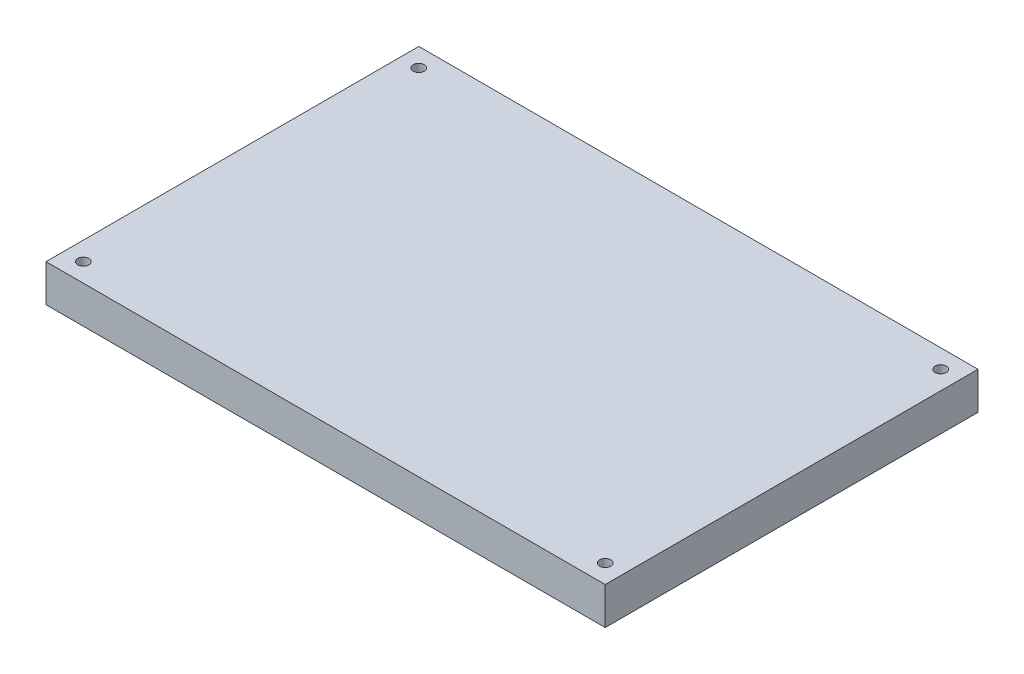
ISO-10303-21;
HEADER;
FILE_DESCRIPTION(('STEP AP214'),'2;1');
FILE_NAME('part.step','',(''),(''),'','','');
FILE_SCHEMA(('AUTOMOTIVE_DESIGN { 1 0 10303 214 1 1 1 1 }'));
ENDSEC;
DATA;
#1=APPLICATION_CONTEXT('core data for automotive mechanical design processes');
#2=APPLICATION_PROTOCOL_DEFINITION('international standard','automotive_design',2000,#1);
#3=PRODUCT_CONTEXT('',#1,'mechanical');
#4=PRODUCT('Part','Part','',(#3));
#5=PRODUCT_RELATED_PRODUCT_CATEGORY('part','',(#4));
#6=PRODUCT_DEFINITION_FORMATION('','',#4);
#7=PRODUCT_DEFINITION_CONTEXT('part definition',#1,'design');
#8=PRODUCT_DEFINITION('design','',#6,#7);
#9=PRODUCT_DEFINITION_SHAPE('','',#8);
#10=(LENGTH_UNIT() NAMED_UNIT(*) SI_UNIT(.MILLI.,.METRE.));
#11=(NAMED_UNIT(*) PLANE_ANGLE_UNIT() SI_UNIT($,.RADIAN.));
#12=(NAMED_UNIT(*) SI_UNIT($,.STERADIAN.) SOLID_ANGLE_UNIT());
#13=UNCERTAINTY_MEASURE_WITH_UNIT(LENGTH_MEASURE(1.E-05),#10,'distance_accuracy_value','');
#14=(GEOMETRIC_REPRESENTATION_CONTEXT(3) GLOBAL_UNCERTAINTY_ASSIGNED_CONTEXT((#13)) GLOBAL_UNIT_ASSIGNED_CONTEXT((#10,
#11,#12)) REPRESENTATION_CONTEXT('',''));
#15=CARTESIAN_POINT('',(0.,0.,0.));
#16=DIRECTION('',(0.,0.,1.));
#17=DIRECTION('',(1.,0.,0.));
#18=AXIS2_PLACEMENT_3D('',#15,#16,#17);
#19=CARTESIAN_POINT('',(0.,20.,0.));
#20=DIRECTION('',(1.,0.,0.));
#21=DIRECTION('',(0.,0.,-1.));
#22=AXIS2_PLACEMENT_3D('',#19,#20,#21);
#23=PLANE('',#22);
#24=DIRECTION('',(0.,0.,1.));
#25=VECTOR('',#24,1.);
#26=CARTESIAN_POINT('',(0.,0.,0.));
#27=LINE('',#26,#25);
#28=CARTESIAN_POINT('',(0.,0.,-200.));
#29=VERTEX_POINT('',#28);
#30=CARTESIAN_POINT('',(0.,0.,0.));
#31=VERTEX_POINT('',#30);
#32=EDGE_CURVE('E98',#29,#31,#27,.T.);
#33=ORIENTED_EDGE('',*,*,#32,.T.);
#34=DIRECTION('',(0.,-1.,0.));
#35=VECTOR('',#34,1.);
#36=CARTESIAN_POINT('',(0.,20.,0.));
#37=LINE('',#36,#35);
#38=CARTESIAN_POINT('',(0.,20.,0.));
#39=VERTEX_POINT('',#38);
#40=EDGE_CURVE('E11',#39,#31,#37,.T.);
#41=ORIENTED_EDGE('',*,*,#40,.F.);
#42=DIRECTION('',(0.,0.,1.));
#43=VECTOR('',#42,1.);
#44=CARTESIAN_POINT('',(0.,20.,0.));
#45=LINE('',#44,#43);
#46=CARTESIAN_POINT('',(0.,20.,-200.));
#47=VERTEX_POINT('',#46);
#48=EDGE_CURVE('E86',#47,#39,#45,.T.);
#49=ORIENTED_EDGE('',*,*,#48,.F.);
#50=DIRECTION('',(0.,-1.,0.));
#51=VECTOR('',#50,1.);
#52=CARTESIAN_POINT('',(0.,20.,-200.));
#53=LINE('',#52,#51);
#54=EDGE_CURVE('E94',#47,#29,#53,.T.);
#55=ORIENTED_EDGE('',*,*,#54,.T.);
#56=EDGE_LOOP('',(#33,#41,#49,#55));
#57=FACE_BOUND('',#56,.T.);
#58=ADVANCED_FACE('F35',(#57),#23,.F.);
#59=CARTESIAN_POINT('',(0.,20.,0.));
#60=DIRECTION('',(0.,0.,-1.));
#61=DIRECTION('',(-1.,0.,0.));
#62=AXIS2_PLACEMENT_3D('',#59,#60,#61);
#63=PLANE('',#62);
#64=DIRECTION('',(1.,0.,0.));
#65=VECTOR('',#64,1.);
#66=CARTESIAN_POINT('',(0.,0.,0.));
#67=LINE('',#66,#65);
#68=CARTESIAN_POINT('',(300.,0.,0.));
#69=VERTEX_POINT('',#68);
#70=EDGE_CURVE('E90',#31,#69,#67,.T.);
#71=ORIENTED_EDGE('',*,*,#70,.T.);
#72=DIRECTION('',(0.,-1.,0.));
#73=VECTOR('',#72,1.);
#74=CARTESIAN_POINT('',(300.,20.,0.));
#75=LINE('',#74,#73);
#76=CARTESIAN_POINT('',(300.,20.,0.));
#77=VERTEX_POINT('',#76);
#78=EDGE_CURVE('E43',#77,#69,#75,.T.);
#79=ORIENTED_EDGE('',*,*,#78,.F.);
#80=DIRECTION('',(1.,0.,0.));
#81=VECTOR('',#80,1.);
#82=CARTESIAN_POINT('',(0.,20.,0.));
#83=LINE('',#82,#81);
#84=EDGE_CURVE('E81',#39,#77,#83,.T.);
#85=ORIENTED_EDGE('',*,*,#84,.F.);
#86=ORIENTED_EDGE('',*,*,#40,.T.);
#87=EDGE_LOOP('',(#71,#79,#85,#86));
#88=FACE_BOUND('',#87,.T.);
#89=ADVANCED_FACE('F89',(#88),#63,.F.);
#90=CARTESIAN_POINT('',(300.,20.,0.));
#91=DIRECTION('',(-1.,0.,0.));
#92=DIRECTION('',(0.,0.,1.));
#93=AXIS2_PLACEMENT_3D('',#90,#91,#92);
#94=PLANE('',#93);
#95=DIRECTION('',(0.,0.,-1.));
#96=VECTOR('',#95,1.);
#97=CARTESIAN_POINT('',(300.,0.,0.));
#98=LINE('',#97,#96);
#99=CARTESIAN_POINT('',(300.,0.,-200.));
#100=VERTEX_POINT('',#99);
#101=EDGE_CURVE('E68',#69,#100,#98,.T.);
#102=ORIENTED_EDGE('',*,*,#101,.T.);
#103=DIRECTION('',(0.,-1.,0.));
#104=VECTOR('',#103,1.);
#105=CARTESIAN_POINT('',(300.,20.,-200.));
#106=LINE('',#105,#104);
#107=CARTESIAN_POINT('',(300.,20.,-200.));
#108=VERTEX_POINT('',#107);
#109=EDGE_CURVE('E91',#108,#100,#106,.T.);
#110=ORIENTED_EDGE('',*,*,#109,.F.);
#111=DIRECTION('',(0.,0.,-1.));
#112=VECTOR('',#111,1.);
#113=CARTESIAN_POINT('',(300.,20.,0.));
#114=LINE('',#113,#112);
#115=EDGE_CURVE('E84',#77,#108,#114,.T.);
#116=ORIENTED_EDGE('',*,*,#115,.F.);
#117=ORIENTED_EDGE('',*,*,#78,.T.);
#118=EDGE_LOOP('',(#102,#110,#116,#117));
#119=FACE_BOUND('',#118,.T.);
#120=ADVANCED_FACE('F92',(#119),#94,.F.);
#121=CARTESIAN_POINT('',(0.,20.,-200.));
#122=DIRECTION('',(0.,0.,1.));
#123=DIRECTION('',(1.,0.,0.));
#124=AXIS2_PLACEMENT_3D('',#121,#122,#123);
#125=PLANE('',#124);
#126=DIRECTION('',(-1.,0.,0.));
#127=VECTOR('',#126,1.);
#128=CARTESIAN_POINT('',(0.,0.,-200.));
#129=LINE('',#128,#127);
#130=EDGE_CURVE('E74',#100,#29,#129,.T.);
#131=ORIENTED_EDGE('',*,*,#130,.T.);
#132=ORIENTED_EDGE('',*,*,#54,.F.);
#133=DIRECTION('',(-1.,0.,0.));
#134=VECTOR('',#133,1.);
#135=CARTESIAN_POINT('',(0.,20.,-200.));
#136=LINE('',#135,#134);
#137=EDGE_CURVE('E51',#108,#47,#136,.T.);
#138=ORIENTED_EDGE('',*,*,#137,.F.);
#139=ORIENTED_EDGE('',*,*,#109,.T.);
#140=EDGE_LOOP('',(#131,#132,#138,#139));
#141=FACE_BOUND('',#140,.T.);
#142=ADVANCED_FACE('F106',(#141),#125,.F.);
#143=CARTESIAN_POINT('',(0.,20.,0.));
#144=DIRECTION('',(0.,-1.,0.));
#145=DIRECTION('',(0.,0.,-1.));
#146=AXIS2_PLACEMENT_3D('',#143,#144,#145);
#147=PLANE('',#146);
#148=CARTESIAN_POINT('',(290.,20.,-10.));
#149=DIRECTION('',(0.,1.,0.));
#150=DIRECTION('',(0.,0.,1.));
#151=AXIS2_PLACEMENT_3D('',#148,#149,#150);
#152=CIRCLE('',#151,2.99999999999999);
#153=CARTESIAN_POINT('',(290.,20.,-7.00000000000001));
#154=VERTEX_POINT('',#153);
#155=EDGE_CURVE('E130',#154,#154,#152,.T.);
#156=ORIENTED_EDGE('',*,*,#155,.F.);
#157=EDGE_LOOP('',(#156));
#158=FACE_BOUND('',#157,.T.);
#159=CARTESIAN_POINT('',(290.,20.,-190.));
#160=DIRECTION('',(0.,1.,0.));
#161=DIRECTION('',(0.,0.,1.));
#162=AXIS2_PLACEMENT_3D('',#159,#160,#161);
#163=CIRCLE('',#162,2.99999999999999);
#164=CARTESIAN_POINT('',(290.,20.,-187.));
#165=VERTEX_POINT('',#164);
#166=EDGE_CURVE('E124',#165,#165,#163,.T.);
#167=ORIENTED_EDGE('',*,*,#166,.F.);
#168=EDGE_LOOP('',(#167));
#169=FACE_BOUND('',#168,.T.);
#170=CARTESIAN_POINT('',(10.,20.,-10.));
#171=DIRECTION('',(0.,1.,0.));
#172=DIRECTION('',(0.,0.,1.));
#173=AXIS2_PLACEMENT_3D('',#170,#171,#172);
#174=CIRCLE('',#173,3.);
#175=CARTESIAN_POINT('',(10.,20.,-7.00000000000001));
#176=VERTEX_POINT('',#175);
#177=EDGE_CURVE('E118',#176,#176,#174,.T.);
#178=ORIENTED_EDGE('',*,*,#177,.F.);
#179=EDGE_LOOP('',(#178));
#180=FACE_BOUND('',#179,.T.);
#181=CARTESIAN_POINT('',(10.,20.,-190.));
#182=DIRECTION('',(0.,1.,0.));
#183=DIRECTION('',(0.,0.,1.));
#184=AXIS2_PLACEMENT_3D('',#181,#182,#183);
#185=CIRCLE('',#184,3.);
#186=CARTESIAN_POINT('',(10.,20.,-187.));
#187=VERTEX_POINT('',#186);
#188=EDGE_CURVE('E112',#187,#187,#185,.T.);
#189=ORIENTED_EDGE('',*,*,#188,.F.);
#190=EDGE_LOOP('',(#189));
#191=FACE_BOUND('',#190,.T.);
#192=ORIENTED_EDGE('',*,*,#48,.T.);
#193=ORIENTED_EDGE('',*,*,#84,.T.);
#194=ORIENTED_EDGE('',*,*,#115,.T.);
#195=ORIENTED_EDGE('',*,*,#137,.T.);
#196=EDGE_LOOP('',(#192,#193,#194,#195));
#197=FACE_BOUND('',#196,.T.);
#198=ADVANCED_FACE('F82',(#158,#169,#180,#191,#197),#147,.F.);
#199=CARTESIAN_POINT('',(0.,0.,0.));
#200=DIRECTION('',(0.,-1.,0.));
#201=DIRECTION('',(0.,0.,-1.));
#202=AXIS2_PLACEMENT_3D('',#199,#200,#201);
#203=PLANE('',#202);
#204=CARTESIAN_POINT('',(290.,0.,-10.));
#205=DIRECTION('',(0.,1.,0.));
#206=DIRECTION('',(0.,0.,1.));
#207=AXIS2_PLACEMENT_3D('',#204,#205,#206);
#208=CIRCLE('',#207,2.99999999999999);
#209=CARTESIAN_POINT('',(290.,0.,-7.00000000000001));
#210=VERTEX_POINT('',#209);
#211=EDGE_CURVE('E127',#210,#210,#208,.T.);
#212=ORIENTED_EDGE('',*,*,#211,.T.);
#213=EDGE_LOOP('',(#212));
#214=FACE_BOUND('',#213,.T.);
#215=CARTESIAN_POINT('',(290.,0.,-190.));
#216=DIRECTION('',(0.,1.,0.));
#217=DIRECTION('',(0.,0.,1.));
#218=AXIS2_PLACEMENT_3D('',#215,#216,#217);
#219=CIRCLE('',#218,2.99999999999999);
#220=CARTESIAN_POINT('',(290.,0.,-187.));
#221=VERTEX_POINT('',#220);
#222=EDGE_CURVE('E121',#221,#221,#219,.T.);
#223=ORIENTED_EDGE('',*,*,#222,.T.);
#224=EDGE_LOOP('',(#223));
#225=FACE_BOUND('',#224,.T.);
#226=CARTESIAN_POINT('',(10.,0.,-10.));
#227=DIRECTION('',(0.,1.,0.));
#228=DIRECTION('',(0.,0.,1.));
#229=AXIS2_PLACEMENT_3D('',#226,#227,#228);
#230=CIRCLE('',#229,3.);
#231=CARTESIAN_POINT('',(10.,0.,-7.00000000000001));
#232=VERTEX_POINT('',#231);
#233=EDGE_CURVE('E115',#232,#232,#230,.T.);
#234=ORIENTED_EDGE('',*,*,#233,.T.);
#235=EDGE_LOOP('',(#234));
#236=FACE_BOUND('',#235,.T.);
#237=CARTESIAN_POINT('',(10.,0.,-190.));
#238=DIRECTION('',(0.,1.,0.));
#239=DIRECTION('',(0.,0.,1.));
#240=AXIS2_PLACEMENT_3D('',#237,#238,#239);
#241=CIRCLE('',#240,3.);
#242=CARTESIAN_POINT('',(10.,0.,-187.));
#243=VERTEX_POINT('',#242);
#244=EDGE_CURVE('E101',#243,#243,#241,.T.);
#245=ORIENTED_EDGE('',*,*,#244,.T.);
#246=EDGE_LOOP('',(#245));
#247=FACE_BOUND('',#246,.T.);
#248=ORIENTED_EDGE('',*,*,#32,.F.);
#249=ORIENTED_EDGE('',*,*,#130,.F.);
#250=ORIENTED_EDGE('',*,*,#101,.F.);
#251=ORIENTED_EDGE('',*,*,#70,.F.);
#252=EDGE_LOOP('',(#248,#249,#250,#251));
#253=FACE_BOUND('',#252,.T.);
#254=ADVANCED_FACE('F109',(#214,#225,#236,#247,#253),#203,.T.);
#255=CARTESIAN_POINT('',(10.,0.,-190.));
#256=DIRECTION('',(0.,1.,0.));
#257=DIRECTION('',(0.,0.,1.));
#258=AXIS2_PLACEMENT_3D('',#255,#256,#257);
#259=CYLINDRICAL_SURFACE('',#258,3.);
#260=ORIENTED_EDGE('',*,*,#244,.F.);
#261=EDGE_LOOP('',(#260));
#262=FACE_BOUND('',#261,.T.);
#263=ORIENTED_EDGE('',*,*,#188,.T.);
#264=EDGE_LOOP('',(#263));
#265=FACE_BOUND('',#264,.T.);
#266=ADVANCED_FACE('F154',(#262,#265),#259,.F.);
#267=CARTESIAN_POINT('',(10.,0.,-10.));
#268=DIRECTION('',(0.,1.,0.));
#269=DIRECTION('',(0.,0.,1.));
#270=AXIS2_PLACEMENT_3D('',#267,#268,#269);
#271=CYLINDRICAL_SURFACE('',#270,3.);
#272=ORIENTED_EDGE('',*,*,#233,.F.);
#273=EDGE_LOOP('',(#272));
#274=FACE_BOUND('',#273,.T.);
#275=ORIENTED_EDGE('',*,*,#177,.T.);
#276=EDGE_LOOP('',(#275));
#277=FACE_BOUND('',#276,.T.);
#278=ADVANCED_FACE('F156',(#274,#277),#271,.F.);
#279=CARTESIAN_POINT('',(290.,0.,-190.));
#280=DIRECTION('',(0.,1.,0.));
#281=DIRECTION('',(0.,0.,1.));
#282=AXIS2_PLACEMENT_3D('',#279,#280,#281);
#283=CYLINDRICAL_SURFACE('',#282,2.99999999999999);
#284=ORIENTED_EDGE('',*,*,#222,.F.);
#285=EDGE_LOOP('',(#284));
#286=FACE_BOUND('',#285,.T.);
#287=ORIENTED_EDGE('',*,*,#166,.T.);
#288=EDGE_LOOP('',(#287));
#289=FACE_BOUND('',#288,.T.);
#290=ADVANCED_FACE('F141',(#286,#289),#283,.F.);
#291=CARTESIAN_POINT('',(290.,0.,-10.));
#292=DIRECTION('',(0.,1.,0.));
#293=DIRECTION('',(0.,0.,1.));
#294=AXIS2_PLACEMENT_3D('',#291,#292,#293);
#295=CYLINDRICAL_SURFACE('',#294,2.99999999999999);
#296=ORIENTED_EDGE('',*,*,#211,.F.);
#297=EDGE_LOOP('',(#296));
#298=FACE_BOUND('',#297,.T.);
#299=ORIENTED_EDGE('',*,*,#155,.T.);
#300=EDGE_LOOP('',(#299));
#301=FACE_BOUND('',#300,.T.);
#302=ADVANCED_FACE('F138',(#298,#301),#295,.F.);
#303=CLOSED_SHELL('',(#58,#89,#120,#142,#198,#254,#266,#278,#290,#302));
#304=MANIFOLD_SOLID_BREP('B2',#303);
#305=ADVANCED_BREP_SHAPE_REPRESENTATION('',(#18,#304),#14);
#306=SHAPE_DEFINITION_REPRESENTATION(#9,#305);
ENDSEC;
END-ISO-10303-21;
